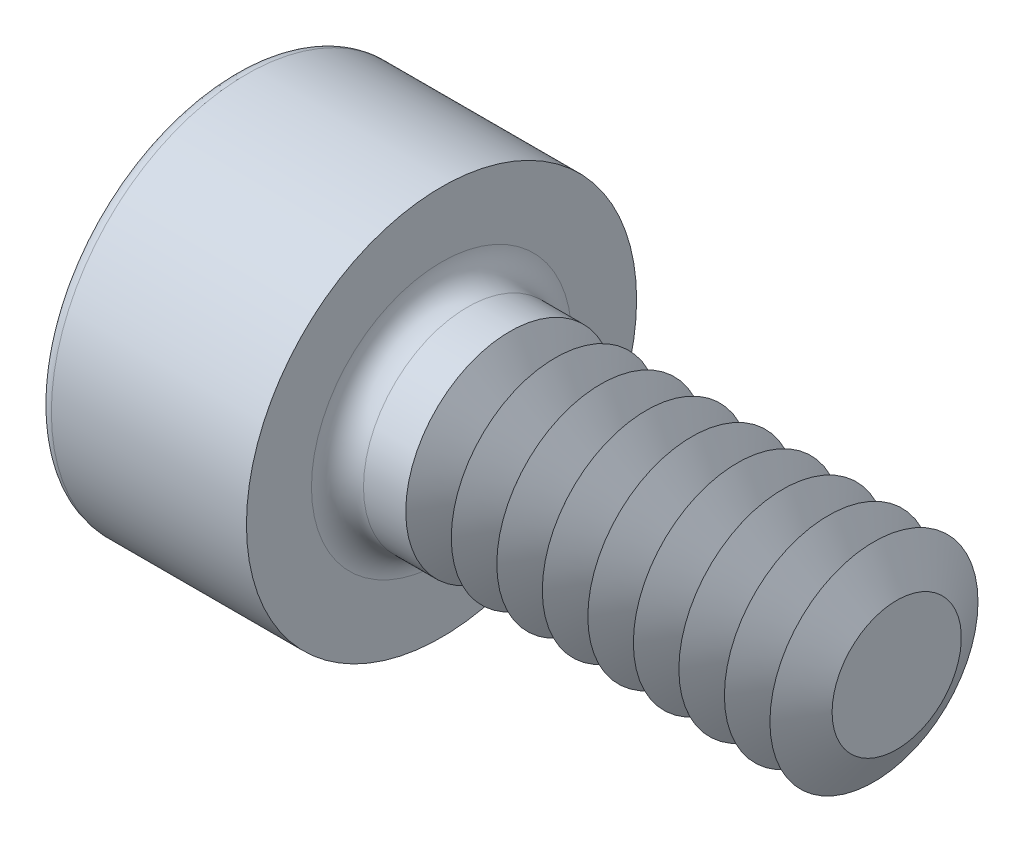
ISO-10303-21;
HEADER;
FILE_DESCRIPTION(('STEP AP214'),'2;1');
FILE_NAME('part.step','',(''),(''),'','','');
FILE_SCHEMA(('AUTOMOTIVE_DESIGN { 1 0 10303 214 1 1 1 1 }'));
ENDSEC;
DATA;
#1=APPLICATION_CONTEXT('core data for automotive mechanical design processes');
#2=APPLICATION_PROTOCOL_DEFINITION('international standard','automotive_design',2000,#1);
#3=PRODUCT_CONTEXT('',#1,'mechanical');
#4=PRODUCT('Part','Part','',(#3));
#5=PRODUCT_RELATED_PRODUCT_CATEGORY('part','',(#4));
#6=PRODUCT_DEFINITION_FORMATION('','',#4);
#7=PRODUCT_DEFINITION_CONTEXT('part definition',#1,'design');
#8=PRODUCT_DEFINITION('design','',#6,#7);
#9=PRODUCT_DEFINITION_SHAPE('','',#8);
#10=(LENGTH_UNIT() NAMED_UNIT(*) SI_UNIT(.MILLI.,.METRE.));
#11=(NAMED_UNIT(*) PLANE_ANGLE_UNIT() SI_UNIT($,.RADIAN.));
#12=(NAMED_UNIT(*) SI_UNIT($,.STERADIAN.) SOLID_ANGLE_UNIT());
#13=UNCERTAINTY_MEASURE_WITH_UNIT(LENGTH_MEASURE(1.E-05),#10,'distance_accuracy_value','');
#14=(GEOMETRIC_REPRESENTATION_CONTEXT(3) GLOBAL_UNCERTAINTY_ASSIGNED_CONTEXT((#13)) GLOBAL_UNIT_ASSIGNED_CONTEXT((#10,
#11,#12)) REPRESENTATION_CONTEXT('',''));
#15=CARTESIAN_POINT('',(0.,0.,0.));
#16=DIRECTION('',(0.,0.,1.));
#17=DIRECTION('',(1.,0.,0.));
#18=AXIS2_PLACEMENT_3D('',#15,#16,#17);
#19=CARTESIAN_POINT('',(0.,0.,0.));
#20=DIRECTION('',(-1.,0.,0.));
#21=DIRECTION('',(0.,0.,1.));
#22=AXIS2_PLACEMENT_3D('',#19,#20,#21);
#23=CYLINDRICAL_SURFACE('',#22,0.8);
#24=CARTESIAN_POINT('',(2.47500513340862,0.,0.));
#25=DIRECTION('',(-1.,0.,0.));
#26=DIRECTION('',(0.,0.,1.));
#27=AXIS2_PLACEMENT_3D('',#24,#25,#26);
#28=CIRCLE('',#27,0.8);
#29=CARTESIAN_POINT('',(2.47500513340862,0.,0.8));
#30=VERTEX_POINT('',#29);
#31=EDGE_CURVE('E299',#30,#30,#28,.T.);
#32=ORIENTED_EDGE('',*,*,#31,.T.);
#33=EDGE_LOOP('',(#32));
#34=FACE_BOUND('',#33,.T.);
#35=CARTESIAN_POINT('',(2.47499486659138,0.,0.));
#36=DIRECTION('',(-1.,0.,0.));
#37=DIRECTION('',(0.,0.,1.));
#38=AXIS2_PLACEMENT_3D('',#35,#36,#37);
#39=CIRCLE('',#38,0.8);
#40=CARTESIAN_POINT('',(2.47499486659138,0.,0.8));
#41=VERTEX_POINT('',#40);
#42=EDGE_CURVE('E295',#41,#41,#39,.T.);
#43=ORIENTED_EDGE('',*,*,#42,.F.);
#44=EDGE_LOOP('',(#43));
#45=FACE_BOUND('',#44,.T.);
#46=ADVANCED_FACE('F41',(#34,#45),#23,.T.);
#47=CARTESIAN_POINT('',(2.82500513340862,0.,0.));
#48=DIRECTION('',(-1.,0.,0.));
#49=DIRECTION('',(0.,0.,1.));
#50=AXIS2_PLACEMENT_3D('',#47,#48,#49);
#51=CIRCLE('',#50,0.8);
#52=CARTESIAN_POINT('',(2.82500513340862,0.,0.8));
#53=VERTEX_POINT('',#52);
#54=EDGE_CURVE('E312',#53,#53,#51,.T.);
#55=ORIENTED_EDGE('',*,*,#54,.T.);
#56=EDGE_LOOP('',(#55));
#57=FACE_BOUND('',#56,.T.);
#58=CARTESIAN_POINT('',(2.82499486659138,0.,0.));
#59=DIRECTION('',(-1.,0.,0.));
#60=DIRECTION('',(0.,0.,1.));
#61=AXIS2_PLACEMENT_3D('',#58,#59,#60);
#62=CIRCLE('',#61,0.8);
#63=CARTESIAN_POINT('',(2.82499486659138,0.,0.8));
#64=VERTEX_POINT('',#63);
#65=EDGE_CURVE('E301',#64,#64,#62,.T.);
#66=ORIENTED_EDGE('',*,*,#65,.F.);
#67=EDGE_LOOP('',(#66));
#68=FACE_BOUND('',#67,.T.);
#69=ADVANCED_FACE('F150',(#57,#68),#23,.T.);
#70=CARTESIAN_POINT('',(3.17500513340862,0.,0.));
#71=DIRECTION('',(-1.,0.,0.));
#72=DIRECTION('',(0.,0.,1.));
#73=AXIS2_PLACEMENT_3D('',#70,#71,#72);
#74=CIRCLE('',#73,0.8);
#75=CARTESIAN_POINT('',(3.17500513340862,0.,0.8));
#76=VERTEX_POINT('',#75);
#77=EDGE_CURVE('E321',#76,#76,#74,.T.);
#78=ORIENTED_EDGE('',*,*,#77,.T.);
#79=EDGE_LOOP('',(#78));
#80=FACE_BOUND('',#79,.T.);
#81=CARTESIAN_POINT('',(3.17499486659138,0.,0.));
#82=DIRECTION('',(-1.,0.,0.));
#83=DIRECTION('',(0.,0.,1.));
#84=AXIS2_PLACEMENT_3D('',#81,#82,#83);
#85=CIRCLE('',#84,0.8);
#86=CARTESIAN_POINT('',(3.17499486659138,0.,0.8));
#87=VERTEX_POINT('',#86);
#88=EDGE_CURVE('E315',#87,#87,#85,.T.);
#89=ORIENTED_EDGE('',*,*,#88,.F.);
#90=EDGE_LOOP('',(#89));
#91=FACE_BOUND('',#90,.T.);
#92=ADVANCED_FACE('F155',(#80,#91),#23,.T.);
#93=CARTESIAN_POINT('',(3.52500513340862,0.,0.));
#94=DIRECTION('',(-1.,0.,0.));
#95=DIRECTION('',(0.,0.,1.));
#96=AXIS2_PLACEMENT_3D('',#93,#94,#95);
#97=CIRCLE('',#96,0.8);
#98=CARTESIAN_POINT('',(3.52500513340862,0.,0.8));
#99=VERTEX_POINT('',#98);
#100=EDGE_CURVE('E330',#99,#99,#97,.T.);
#101=ORIENTED_EDGE('',*,*,#100,.T.);
#102=EDGE_LOOP('',(#101));
#103=FACE_BOUND('',#102,.T.);
#104=CARTESIAN_POINT('',(3.52499486659138,0.,0.));
#105=DIRECTION('',(-1.,0.,0.));
#106=DIRECTION('',(0.,0.,1.));
#107=AXIS2_PLACEMENT_3D('',#104,#105,#106);
#108=CIRCLE('',#107,0.8);
#109=CARTESIAN_POINT('',(3.52499486659138,0.,0.8));
#110=VERTEX_POINT('',#109);
#111=EDGE_CURVE('E324',#110,#110,#108,.T.);
#112=ORIENTED_EDGE('',*,*,#111,.F.);
#113=EDGE_LOOP('',(#112));
#114=FACE_BOUND('',#113,.T.);
#115=ADVANCED_FACE('F644',(#103,#114),#23,.T.);
#116=CARTESIAN_POINT('',(3.87500513340862,0.,0.));
#117=DIRECTION('',(-1.,0.,0.));
#118=DIRECTION('',(0.,0.,1.));
#119=AXIS2_PLACEMENT_3D('',#116,#117,#118);
#120=CIRCLE('',#119,0.8);
#121=CARTESIAN_POINT('',(3.87500513340862,0.,0.8));
#122=VERTEX_POINT('',#121);
#123=EDGE_CURVE('E339',#122,#122,#120,.T.);
#124=ORIENTED_EDGE('',*,*,#123,.T.);
#125=EDGE_LOOP('',(#124));
#126=FACE_BOUND('',#125,.T.);
#127=CARTESIAN_POINT('',(3.87499486659138,0.,0.));
#128=DIRECTION('',(-1.,0.,0.));
#129=DIRECTION('',(0.,0.,1.));
#130=AXIS2_PLACEMENT_3D('',#127,#128,#129);
#131=CIRCLE('',#130,0.8);
#132=CARTESIAN_POINT('',(3.87499486659138,0.,0.8));
#133=VERTEX_POINT('',#132);
#134=EDGE_CURVE('E333',#133,#133,#131,.T.);
#135=ORIENTED_EDGE('',*,*,#134,.F.);
#136=EDGE_LOOP('',(#135));
#137=FACE_BOUND('',#136,.T.);
#138=ADVANCED_FACE('F635',(#126,#137),#23,.T.);
#139=CARTESIAN_POINT('',(4.22500513340862,0.,0.));
#140=DIRECTION('',(-1.,0.,0.));
#141=DIRECTION('',(0.,0.,1.));
#142=AXIS2_PLACEMENT_3D('',#139,#140,#141);
#143=CIRCLE('',#142,0.8);
#144=CARTESIAN_POINT('',(4.22500513340862,0.,0.8));
#145=VERTEX_POINT('',#144);
#146=EDGE_CURVE('E348',#145,#145,#143,.T.);
#147=ORIENTED_EDGE('',*,*,#146,.T.);
#148=EDGE_LOOP('',(#147));
#149=FACE_BOUND('',#148,.T.);
#150=CARTESIAN_POINT('',(4.22499486659138,0.,0.));
#151=DIRECTION('',(-1.,0.,0.));
#152=DIRECTION('',(0.,0.,1.));
#153=AXIS2_PLACEMENT_3D('',#150,#151,#152);
#154=CIRCLE('',#153,0.8);
#155=CARTESIAN_POINT('',(4.22499486659138,0.,0.8));
#156=VERTEX_POINT('',#155);
#157=EDGE_CURVE('E342',#156,#156,#154,.T.);
#158=ORIENTED_EDGE('',*,*,#157,.F.);
#159=EDGE_LOOP('',(#158));
#160=FACE_BOUND('',#159,.T.);
#161=ADVANCED_FACE('F239',(#149,#160),#23,.T.);
#162=CARTESIAN_POINT('',(4.22500513340862,0.,0.));
#163=DIRECTION('',(-1.,0.,0.));
#164=DIRECTION('',(0.,0.,1.));
#165=AXIS2_PLACEMENT_3D('',#162,#163,#164);
#166=CONICAL_SURFACE('',#165,0.8,1.04719755119659);
#167=CARTESIAN_POINT('',(4.4,0.,0.));
#168=DIRECTION('',(-1.,0.,0.));
#169=DIRECTION('',(0.,0.,1.));
#170=AXIS2_PLACEMENT_3D('',#167,#168,#169);
#171=CIRCLE('',#170,0.4969);
#172=CARTESIAN_POINT('',(4.4,0.,0.4969));
#173=VERTEX_POINT('',#172);
#174=EDGE_CURVE('E354',#173,#173,#171,.T.);
#175=ORIENTED_EDGE('',*,*,#174,.T.);
#176=EDGE_LOOP('',(#175));
#177=FACE_BOUND('',#176,.T.);
#178=ORIENTED_EDGE('',*,*,#146,.F.);
#179=EDGE_LOOP('',(#178));
#180=FACE_BOUND('',#179,.T.);
#181=ADVANCED_FACE('F235',(#177,#180),#166,.T.);
#182=CARTESIAN_POINT('',(4.4,0.,0.));
#183=DIRECTION('',(1.,0.,0.));
#184=DIRECTION('',(0.,0.,-1.));
#185=AXIS2_PLACEMENT_3D('',#182,#183,#184);
#186=CONICAL_SURFACE('',#185,0.4969,1.04719755119659);
#187=CARTESIAN_POINT('',(4.57499486659138,0.,0.));
#188=DIRECTION('',(-1.,0.,0.));
#189=DIRECTION('',(0.,0.,1.));
#190=AXIS2_PLACEMENT_3D('',#187,#188,#189);
#191=CIRCLE('',#190,0.8);
#192=CARTESIAN_POINT('',(4.57499486659138,0.,0.8));
#193=VERTEX_POINT('',#192);
#194=EDGE_CURVE('E351',#193,#193,#191,.T.);
#195=ORIENTED_EDGE('',*,*,#194,.T.);
#196=EDGE_LOOP('',(#195));
#197=FACE_BOUND('',#196,.T.);
#198=ORIENTED_EDGE('',*,*,#174,.F.);
#199=EDGE_LOOP('',(#198));
#200=FACE_BOUND('',#199,.T.);
#201=ADVANCED_FACE('F238',(#197,#200),#186,.T.);
#202=CARTESIAN_POINT('',(5.1,0.8,0.));
#203=DIRECTION('',(-1.,0.,0.));
#204=DIRECTION('',(0.,0.,1.));
#205=AXIS2_PLACEMENT_3D('',#202,#203,#204);
#206=PLANE('',#205);
#207=CARTESIAN_POINT('',(5.1,0.,0.));
#208=DIRECTION('',(-1.,0.,0.));
#209=DIRECTION('',(0.,0.,1.));
#210=AXIS2_PLACEMENT_3D('',#207,#208,#209);
#211=CIRCLE('',#210,0.4969);
#212=CARTESIAN_POINT('',(5.1,0.,0.4969));
#213=VERTEX_POINT('',#212);
#214=EDGE_CURVE('E369',#213,#213,#211,.T.);
#215=ORIENTED_EDGE('',*,*,#214,.F.);
#216=EDGE_LOOP('',(#215));
#217=FACE_BOUND('',#216,.T.);
#218=ADVANCED_FACE('F161',(#217),#206,.F.);
#219=CARTESIAN_POINT('',(4.92500513340862,0.,0.));
#220=DIRECTION('',(-1.,0.,0.));
#221=DIRECTION('',(0.,0.,1.));
#222=AXIS2_PLACEMENT_3D('',#219,#220,#221);
#223=CONICAL_SURFACE('',#222,0.8,1.04719755119659);
#224=ORIENTED_EDGE('',*,*,#214,.T.);
#225=EDGE_LOOP('',(#224));
#226=FACE_BOUND('',#225,.T.);
#227=CARTESIAN_POINT('',(4.92500513340862,0.,0.));
#228=DIRECTION('',(-1.,0.,0.));
#229=DIRECTION('',(0.,0.,1.));
#230=AXIS2_PLACEMENT_3D('',#227,#228,#229);
#231=CIRCLE('',#230,0.8);
#232=CARTESIAN_POINT('',(4.92500513340862,0.,0.8));
#233=VERTEX_POINT('',#232);
#234=EDGE_CURVE('E366',#233,#233,#231,.T.);
#235=ORIENTED_EDGE('',*,*,#234,.F.);
#236=EDGE_LOOP('',(#235));
#237=FACE_BOUND('',#236,.T.);
#238=ADVANCED_FACE('F222',(#226,#237),#223,.T.);
#239=ORIENTED_EDGE('',*,*,#234,.T.);
#240=EDGE_LOOP('',(#239));
#241=FACE_BOUND('',#240,.T.);
#242=CARTESIAN_POINT('',(4.92499486659138,0.,0.));
#243=DIRECTION('',(-1.,0.,0.));
#244=DIRECTION('',(0.,0.,1.));
#245=AXIS2_PLACEMENT_3D('',#242,#243,#244);
#246=CIRCLE('',#245,0.8);
#247=CARTESIAN_POINT('',(4.92499486659138,0.,0.8));
#248=VERTEX_POINT('',#247);
#249=EDGE_CURVE('E360',#248,#248,#246,.T.);
#250=ORIENTED_EDGE('',*,*,#249,.F.);
#251=EDGE_LOOP('',(#250));
#252=FACE_BOUND('',#251,.T.);
#253=ADVANCED_FACE('F147',(#241,#252),#23,.T.);
#254=CARTESIAN_POINT('',(4.75,0.,0.));
#255=DIRECTION('',(1.,0.,0.));
#256=DIRECTION('',(0.,0.,-1.));
#257=AXIS2_PLACEMENT_3D('',#254,#255,#256);
#258=CONICAL_SURFACE('',#257,0.4969,1.04719755119659);
#259=ORIENTED_EDGE('',*,*,#249,.T.);
#260=EDGE_LOOP('',(#259));
#261=FACE_BOUND('',#260,.T.);
#262=CARTESIAN_POINT('',(4.75,0.,0.));
#263=DIRECTION('',(-1.,0.,0.));
#264=DIRECTION('',(0.,0.,1.));
#265=AXIS2_PLACEMENT_3D('',#262,#263,#264);
#266=CIRCLE('',#265,0.4969);
#267=CARTESIAN_POINT('',(4.75,0.,0.4969));
#268=VERTEX_POINT('',#267);
#269=EDGE_CURVE('E363',#268,#268,#266,.T.);
#270=ORIENTED_EDGE('',*,*,#269,.F.);
#271=EDGE_LOOP('',(#270));
#272=FACE_BOUND('',#271,.T.);
#273=ADVANCED_FACE('F230',(#261,#272),#258,.T.);
#274=CARTESIAN_POINT('',(4.57500513340862,0.,0.));
#275=DIRECTION('',(-1.,0.,0.));
#276=DIRECTION('',(0.,0.,1.));
#277=AXIS2_PLACEMENT_3D('',#274,#275,#276);
#278=CONICAL_SURFACE('',#277,0.8,1.04719755119659);
#279=ORIENTED_EDGE('',*,*,#269,.T.);
#280=EDGE_LOOP('',(#279));
#281=FACE_BOUND('',#280,.T.);
#282=CARTESIAN_POINT('',(4.57500513340862,0.,0.));
#283=DIRECTION('',(-1.,0.,0.));
#284=DIRECTION('',(0.,0.,1.));
#285=AXIS2_PLACEMENT_3D('',#282,#283,#284);
#286=CIRCLE('',#285,0.8);
#287=CARTESIAN_POINT('',(4.57500513340862,0.,0.8));
#288=VERTEX_POINT('',#287);
#289=EDGE_CURVE('E357',#288,#288,#286,.T.);
#290=ORIENTED_EDGE('',*,*,#289,.F.);
#291=EDGE_LOOP('',(#290));
#292=FACE_BOUND('',#291,.T.);
#293=ADVANCED_FACE('F226',(#281,#292),#278,.T.);
#294=ORIENTED_EDGE('',*,*,#289,.T.);
#295=EDGE_LOOP('',(#294));
#296=FACE_BOUND('',#295,.T.);
#297=ORIENTED_EDGE('',*,*,#194,.F.);
#298=EDGE_LOOP('',(#297));
#299=FACE_BOUND('',#298,.T.);
#300=ADVANCED_FACE('F229',(#296,#299),#23,.T.);
#301=CARTESIAN_POINT('',(3.87500513340862,0.,0.));
#302=DIRECTION('',(-1.,0.,0.));
#303=DIRECTION('',(0.,0.,1.));
#304=AXIS2_PLACEMENT_3D('',#301,#302,#303);
#305=CONICAL_SURFACE('',#304,0.8,1.04719755119659);
#306=CARTESIAN_POINT('',(4.05,0.,0.));
#307=DIRECTION('',(-1.,0.,0.));
#308=DIRECTION('',(0.,0.,1.));
#309=AXIS2_PLACEMENT_3D('',#306,#307,#308);
#310=CIRCLE('',#309,0.4969);
#311=CARTESIAN_POINT('',(4.05,0.,0.4969));
#312=VERTEX_POINT('',#311);
#313=EDGE_CURVE('E345',#312,#312,#310,.T.);
#314=ORIENTED_EDGE('',*,*,#313,.T.);
#315=EDGE_LOOP('',(#314));
#316=FACE_BOUND('',#315,.T.);
#317=ORIENTED_EDGE('',*,*,#123,.F.);
#318=EDGE_LOOP('',(#317));
#319=FACE_BOUND('',#318,.T.);
#320=ADVANCED_FACE('F244',(#316,#319),#305,.T.);
#321=CARTESIAN_POINT('',(4.05,0.,0.));
#322=DIRECTION('',(1.,0.,0.));
#323=DIRECTION('',(0.,0.,-1.));
#324=AXIS2_PLACEMENT_3D('',#321,#322,#323);
#325=CONICAL_SURFACE('',#324,0.4969,1.04719755119659);
#326=ORIENTED_EDGE('',*,*,#157,.T.);
#327=EDGE_LOOP('',(#326));
#328=FACE_BOUND('',#327,.T.);
#329=ORIENTED_EDGE('',*,*,#313,.F.);
#330=EDGE_LOOP('',(#329));
#331=FACE_BOUND('',#330,.T.);
#332=ADVANCED_FACE('F247',(#328,#331),#325,.T.);
#333=CARTESIAN_POINT('',(3.52500513340862,0.,0.));
#334=DIRECTION('',(-1.,0.,0.));
#335=DIRECTION('',(0.,0.,1.));
#336=AXIS2_PLACEMENT_3D('',#333,#334,#335);
#337=CONICAL_SURFACE('',#336,0.8,1.04719755119659);
#338=CARTESIAN_POINT('',(3.7,0.,0.));
#339=DIRECTION('',(-1.,0.,0.));
#340=DIRECTION('',(0.,0.,1.));
#341=AXIS2_PLACEMENT_3D('',#338,#339,#340);
#342=CIRCLE('',#341,0.4969);
#343=CARTESIAN_POINT('',(3.7,0.,0.4969));
#344=VERTEX_POINT('',#343);
#345=EDGE_CURVE('E336',#344,#344,#342,.T.);
#346=ORIENTED_EDGE('',*,*,#345,.T.);
#347=EDGE_LOOP('',(#346));
#348=FACE_BOUND('',#347,.T.);
#349=ORIENTED_EDGE('',*,*,#100,.F.);
#350=EDGE_LOOP('',(#349));
#351=FACE_BOUND('',#350,.T.);
#352=ADVANCED_FACE('F251',(#348,#351),#337,.T.);
#353=CARTESIAN_POINT('',(3.7,0.,0.));
#354=DIRECTION('',(1.,0.,0.));
#355=DIRECTION('',(0.,0.,-1.));
#356=AXIS2_PLACEMENT_3D('',#353,#354,#355);
#357=CONICAL_SURFACE('',#356,0.4969,1.04719755119659);
#358=ORIENTED_EDGE('',*,*,#134,.T.);
#359=EDGE_LOOP('',(#358));
#360=FACE_BOUND('',#359,.T.);
#361=ORIENTED_EDGE('',*,*,#345,.F.);
#362=EDGE_LOOP('',(#361));
#363=FACE_BOUND('',#362,.T.);
#364=ADVANCED_FACE('F255',(#360,#363),#357,.T.);
#365=CARTESIAN_POINT('',(3.17500513340862,0.,0.));
#366=DIRECTION('',(-1.,0.,0.));
#367=DIRECTION('',(0.,0.,1.));
#368=AXIS2_PLACEMENT_3D('',#365,#366,#367);
#369=CONICAL_SURFACE('',#368,0.8,1.04719755119659);
#370=CARTESIAN_POINT('',(3.35,0.,0.));
#371=DIRECTION('',(-1.,0.,0.));
#372=DIRECTION('',(0.,0.,1.));
#373=AXIS2_PLACEMENT_3D('',#370,#371,#372);
#374=CIRCLE('',#373,0.4969);
#375=CARTESIAN_POINT('',(3.35,0.,0.4969));
#376=VERTEX_POINT('',#375);
#377=EDGE_CURVE('E327',#376,#376,#374,.T.);
#378=ORIENTED_EDGE('',*,*,#377,.T.);
#379=EDGE_LOOP('',(#378));
#380=FACE_BOUND('',#379,.T.);
#381=ORIENTED_EDGE('',*,*,#77,.F.);
#382=EDGE_LOOP('',(#381));
#383=FACE_BOUND('',#382,.T.);
#384=ADVANCED_FACE('F259',(#380,#383),#369,.T.);
#385=CARTESIAN_POINT('',(3.35,0.,0.));
#386=DIRECTION('',(1.,0.,0.));
#387=DIRECTION('',(0.,0.,-1.));
#388=AXIS2_PLACEMENT_3D('',#385,#386,#387);
#389=CONICAL_SURFACE('',#388,0.4969,1.04719755119659);
#390=ORIENTED_EDGE('',*,*,#111,.T.);
#391=EDGE_LOOP('',(#390));
#392=FACE_BOUND('',#391,.T.);
#393=ORIENTED_EDGE('',*,*,#377,.F.);
#394=EDGE_LOOP('',(#393));
#395=FACE_BOUND('',#394,.T.);
#396=ADVANCED_FACE('F263',(#392,#395),#389,.T.);
#397=CARTESIAN_POINT('',(2.82500513340862,0.,0.));
#398=DIRECTION('',(-1.,0.,0.));
#399=DIRECTION('',(0.,0.,1.));
#400=AXIS2_PLACEMENT_3D('',#397,#398,#399);
#401=CONICAL_SURFACE('',#400,0.8,1.04719755119659);
#402=CARTESIAN_POINT('',(3.,0.,0.));
#403=DIRECTION('',(-1.,0.,0.));
#404=DIRECTION('',(0.,0.,1.));
#405=AXIS2_PLACEMENT_3D('',#402,#403,#404);
#406=CIRCLE('',#405,0.4969);
#407=CARTESIAN_POINT('',(3.,0.,0.4969));
#408=VERTEX_POINT('',#407);
#409=EDGE_CURVE('E318',#408,#408,#406,.T.);
#410=ORIENTED_EDGE('',*,*,#409,.T.);
#411=EDGE_LOOP('',(#410));
#412=FACE_BOUND('',#411,.T.);
#413=ORIENTED_EDGE('',*,*,#54,.F.);
#414=EDGE_LOOP('',(#413));
#415=FACE_BOUND('',#414,.T.);
#416=ADVANCED_FACE('F267',(#412,#415),#401,.T.);
#417=CARTESIAN_POINT('',(3.,0.,0.));
#418=DIRECTION('',(1.,0.,0.));
#419=DIRECTION('',(0.,0.,-1.));
#420=AXIS2_PLACEMENT_3D('',#417,#418,#419);
#421=CONICAL_SURFACE('',#420,0.4969,1.04719755119659);
#422=ORIENTED_EDGE('',*,*,#88,.T.);
#423=EDGE_LOOP('',(#422));
#424=FACE_BOUND('',#423,.T.);
#425=ORIENTED_EDGE('',*,*,#409,.F.);
#426=EDGE_LOOP('',(#425));
#427=FACE_BOUND('',#426,.T.);
#428=ADVANCED_FACE('F271',(#424,#427),#421,.T.);
#429=CARTESIAN_POINT('',(2.47500513340862,0.,0.));
#430=DIRECTION('',(-1.,0.,0.));
#431=DIRECTION('',(0.,0.,1.));
#432=AXIS2_PLACEMENT_3D('',#429,#430,#431);
#433=CONICAL_SURFACE('',#432,0.8,1.04719755119659);
#434=CARTESIAN_POINT('',(2.65,0.,0.));
#435=DIRECTION('',(-1.,0.,0.));
#436=DIRECTION('',(0.,0.,1.));
#437=AXIS2_PLACEMENT_3D('',#434,#435,#436);
#438=CIRCLE('',#437,0.4969);
#439=CARTESIAN_POINT('',(2.65,0.,0.4969));
#440=VERTEX_POINT('',#439);
#441=EDGE_CURVE('E309',#440,#440,#438,.T.);
#442=ORIENTED_EDGE('',*,*,#441,.T.);
#443=EDGE_LOOP('',(#442));
#444=FACE_BOUND('',#443,.T.);
#445=ORIENTED_EDGE('',*,*,#31,.F.);
#446=EDGE_LOOP('',(#445));
#447=FACE_BOUND('',#446,.T.);
#448=ADVANCED_FACE('F275',(#444,#447),#433,.T.);
#449=CARTESIAN_POINT('',(2.65,0.,0.));
#450=DIRECTION('',(1.,0.,0.));
#451=DIRECTION('',(0.,0.,-1.));
#452=AXIS2_PLACEMENT_3D('',#449,#450,#451);
#453=CONICAL_SURFACE('',#452,0.4969,1.04719755119659);
#454=ORIENTED_EDGE('',*,*,#65,.T.);
#455=EDGE_LOOP('',(#454));
#456=FACE_BOUND('',#455,.T.);
#457=ORIENTED_EDGE('',*,*,#441,.F.);
#458=EDGE_LOOP('',(#457));
#459=FACE_BOUND('',#458,.T.);
#460=ADVANCED_FACE('F279',(#456,#459),#453,.T.);
#461=CARTESIAN_POINT('',(2.12500513340862,0.,0.));
#462=DIRECTION('',(-1.,0.,0.));
#463=DIRECTION('',(0.,0.,1.));
#464=AXIS2_PLACEMENT_3D('',#461,#462,#463);
#465=CONICAL_SURFACE('',#464,0.8,1.04719755119659);
#466=CARTESIAN_POINT('',(2.3,0.,0.));
#467=DIRECTION('',(-1.,0.,0.));
#468=DIRECTION('',(0.,0.,1.));
#469=AXIS2_PLACEMENT_3D('',#466,#467,#468);
#470=CIRCLE('',#469,0.4969);
#471=CARTESIAN_POINT('',(2.3,0.,0.4969));
#472=VERTEX_POINT('',#471);
#473=EDGE_CURVE('E298',#472,#472,#470,.T.);
#474=ORIENTED_EDGE('',*,*,#473,.T.);
#475=EDGE_LOOP('',(#474));
#476=FACE_BOUND('',#475,.T.);
#477=CARTESIAN_POINT('',(2.12500513340862,0.,0.));
#478=DIRECTION('',(-1.,0.,0.));
#479=DIRECTION('',(0.,0.,1.));
#480=AXIS2_PLACEMENT_3D('',#477,#478,#479);
#481=CIRCLE('',#480,0.8);
#482=CARTESIAN_POINT('',(2.12500513340862,0.,0.8));
#483=VERTEX_POINT('',#482);
#484=EDGE_CURVE('E303',#483,#483,#481,.T.);
#485=ORIENTED_EDGE('',*,*,#484,.F.);
#486=EDGE_LOOP('',(#485));
#487=FACE_BOUND('',#486,.T.);
#488=ADVANCED_FACE('F283',(#476,#487),#465,.T.);
#489=CARTESIAN_POINT('',(2.3,0.,0.));
#490=DIRECTION('',(1.,0.,0.));
#491=DIRECTION('',(0.,0.,-1.));
#492=AXIS2_PLACEMENT_3D('',#489,#490,#491);
#493=CONICAL_SURFACE('',#492,0.4969,1.04719755119659);
#494=ORIENTED_EDGE('',*,*,#42,.T.);
#495=EDGE_LOOP('',(#494));
#496=FACE_BOUND('',#495,.T.);
#497=ORIENTED_EDGE('',*,*,#473,.F.);
#498=EDGE_LOOP('',(#497));
#499=FACE_BOUND('',#498,.T.);
#500=ADVANCED_FACE('F211',(#496,#499),#493,.T.);
#501=CARTESIAN_POINT('',(0.7,0.749111974273539,-0.4325));
#502=DIRECTION('',(-0.898067507594914,-0.439857649475667,0.));
#503=DIRECTION('',(0.439857649475667,-0.898067507594914,0.));
#504=AXIS2_PLACEMENT_3D('',#501,#502,#503);
#505=PLANE('',#504);
#506=DIRECTION('',(-0.39048865355203,0.797269689995388,-0.460303870135567));
#507=VECTOR('',#506,1.);
#508=CARTESIAN_POINT('',(1.06690185249043,0.,0.));
#509=LINE('',#508,#507);
#510=CARTESIAN_POINT('',(1.06690185249043,0.,0.));
#511=VERTEX_POINT('',#510);
#512=CARTESIAN_POINT('',(0.7,0.749111974273539,-0.4325));
#513=VERTEX_POINT('',#512);
#514=EDGE_CURVE('E378',#511,#513,#509,.T.);
#515=ORIENTED_EDGE('',*,*,#514,.F.);
#516=DIRECTION('',(-0.39048865355203,0.797269689995388,0.460303870135567));
#517=VECTOR('',#516,1.);
#518=CARTESIAN_POINT('',(1.06690185249043,0.,0.));
#519=LINE('',#518,#517);
#520=CARTESIAN_POINT('',(0.7,0.749111974273539,0.4325));
#521=VERTEX_POINT('',#520);
#522=EDGE_CURVE('E384',#511,#521,#519,.T.);
#523=ORIENTED_EDGE('',*,*,#522,.T.);
#524=DIRECTION('',(0.,0.,-1.));
#525=VECTOR('',#524,1.);
#526=CARTESIAN_POINT('',(0.7,0.749111974273539,0.4325));
#527=LINE('',#526,#525);
#528=EDGE_CURVE('E391',#521,#513,#527,.T.);
#529=ORIENTED_EDGE('',*,*,#528,.T.);
#530=EDGE_LOOP('',(#515,#523,#529));
#531=FACE_BOUND('',#530,.T.);
#532=ADVANCED_FACE('F207',(#531),#505,.T.);
#533=CARTESIAN_POINT('',(0.7,0.,-0.865));
#534=DIRECTION('',(-0.898067507594914,-0.219928824737834,0.380927898494839));
#535=DIRECTION('',(0.39048865355203,0.,0.920607740271133));
#536=AXIS2_PLACEMENT_3D('',#533,#534,#535);
#537=PLANE('',#536);
#538=DIRECTION('',(-0.39048865355203,0.,-0.920607740271133));
#539=VECTOR('',#538,1.);
#540=CARTESIAN_POINT('',(1.06690185249043,0.,0.));
#541=LINE('',#540,#539);
#542=CARTESIAN_POINT('',(0.7,0.,-0.865));
#543=VERTEX_POINT('',#542);
#544=EDGE_CURVE('E374',#511,#543,#541,.T.);
#545=ORIENTED_EDGE('',*,*,#544,.F.);
#546=ORIENTED_EDGE('',*,*,#514,.T.);
#547=DIRECTION('',(0.,-0.866025403784439,-0.5));
#548=VECTOR('',#547,1.);
#549=CARTESIAN_POINT('',(0.7,0.749111974273539,-0.4325));
#550=LINE('',#549,#548);
#551=EDGE_CURVE('E394',#513,#543,#550,.T.);
#552=ORIENTED_EDGE('',*,*,#551,.T.);
#553=EDGE_LOOP('',(#545,#546,#552));
#554=FACE_BOUND('',#553,.T.);
#555=ADVANCED_FACE('F210',(#554),#537,.T.);
#556=CARTESIAN_POINT('',(0.7,-0.749111974273539,-0.4325));
#557=DIRECTION('',(-0.898067507594914,0.219928824737834,0.380927898494839));
#558=DIRECTION('',(0.39048865355203,0.,0.920607740271133));
#559=AXIS2_PLACEMENT_3D('',#556,#557,#558);
#560=PLANE('',#559);
#561=DIRECTION('',(-0.39048865355203,-0.797269689995388,-0.460303870135567));
#562=VECTOR('',#561,1.);
#563=CARTESIAN_POINT('',(1.06690185249043,0.,0.));
#564=LINE('',#563,#562);
#565=CARTESIAN_POINT('',(0.7,-0.749111974273539,-0.4325));
#566=VERTEX_POINT('',#565);
#567=EDGE_CURVE('E65',#511,#566,#564,.T.);
#568=ORIENTED_EDGE('',*,*,#567,.F.);
#569=ORIENTED_EDGE('',*,*,#544,.T.);
#570=DIRECTION('',(0.,-0.866025403784439,0.5));
#571=VECTOR('',#570,1.);
#572=CARTESIAN_POINT('',(0.7,0.,-0.865));
#573=LINE('',#572,#571);
#574=EDGE_CURVE('E397',#543,#566,#573,.T.);
#575=ORIENTED_EDGE('',*,*,#574,.T.);
#576=EDGE_LOOP('',(#568,#569,#575));
#577=FACE_BOUND('',#576,.T.);
#578=ADVANCED_FACE('F215',(#577),#560,.T.);
#579=CARTESIAN_POINT('',(0.7,-0.749111974273539,0.4325));
#580=DIRECTION('',(-0.898067507594914,0.439857649475667,0.));
#581=DIRECTION('',(-0.439857649475667,-0.898067507594914,0.));
#582=AXIS2_PLACEMENT_3D('',#579,#580,#581);
#583=PLANE('',#582);
#584=DIRECTION('',(-0.39048865355203,-0.797269689995388,0.460303870135567));
#585=VECTOR('',#584,1.);
#586=CARTESIAN_POINT('',(1.06690185249043,0.,0.));
#587=LINE('',#586,#585);
#588=CARTESIAN_POINT('',(0.7,-0.749111974273539,0.4325));
#589=VERTEX_POINT('',#588);
#590=EDGE_CURVE('E381',#511,#589,#587,.T.);
#591=ORIENTED_EDGE('',*,*,#590,.F.);
#592=ORIENTED_EDGE('',*,*,#567,.T.);
#593=DIRECTION('',(0.,0.,1.));
#594=VECTOR('',#593,1.);
#595=CARTESIAN_POINT('',(0.7,-0.749111974273539,-0.4325));
#596=LINE('',#595,#594);
#597=EDGE_CURVE('E93',#566,#589,#596,.T.);
#598=ORIENTED_EDGE('',*,*,#597,.T.);
#599=EDGE_LOOP('',(#591,#592,#598));
#600=FACE_BOUND('',#599,.T.);
#601=ADVANCED_FACE('F205',(#600),#583,.T.);
#602=CARTESIAN_POINT('',(0.7,0.,0.865));
#603=DIRECTION('',(-0.898067507594914,0.219928824737834,-0.380927898494839));
#604=DIRECTION('',(-0.39048865355203,0.,0.920607740271134));
#605=AXIS2_PLACEMENT_3D('',#602,#603,#604);
#606=PLANE('',#605);
#607=DIRECTION('',(-0.39048865355203,0.,0.920607740271133));
#608=VECTOR('',#607,1.);
#609=CARTESIAN_POINT('',(1.06690185249043,0.,0.));
#610=LINE('',#609,#608);
#611=CARTESIAN_POINT('',(0.7,0.,0.865));
#612=VERTEX_POINT('',#611);
#613=EDGE_CURVE('E373',#511,#612,#610,.T.);
#614=ORIENTED_EDGE('',*,*,#613,.F.);
#615=ORIENTED_EDGE('',*,*,#590,.T.);
#616=DIRECTION('',(0.,0.866025403784439,0.5));
#617=VECTOR('',#616,1.);
#618=CARTESIAN_POINT('',(0.7,-0.749111974273539,0.4325));
#619=LINE('',#618,#617);
#620=EDGE_CURVE('E110',#589,#612,#619,.T.);
#621=ORIENTED_EDGE('',*,*,#620,.T.);
#622=EDGE_LOOP('',(#614,#615,#621));
#623=FACE_BOUND('',#622,.T.);
#624=ADVANCED_FACE('F201',(#623),#606,.T.);
#625=CARTESIAN_POINT('',(0.7,0.749111974273539,0.4325));
#626=DIRECTION('',(-0.898067507594914,-0.219928824737834,-0.380927898494839));
#627=DIRECTION('',(-0.39048865355203,0.,0.920607740271133));
#628=AXIS2_PLACEMENT_3D('',#625,#626,#627);
#629=PLANE('',#628);
#630=ORIENTED_EDGE('',*,*,#522,.F.);
#631=ORIENTED_EDGE('',*,*,#613,.T.);
#632=DIRECTION('',(0.,0.866025403784439,-0.5));
#633=VECTOR('',#632,1.);
#634=CARTESIAN_POINT('',(0.7,0.,0.865));
#635=LINE('',#634,#633);
#636=EDGE_CURVE('E113',#612,#521,#635,.T.);
#637=ORIENTED_EDGE('',*,*,#636,.T.);
#638=EDGE_LOOP('',(#630,#631,#637));
#639=FACE_BOUND('',#638,.T.);
#640=ADVANCED_FACE('F190',(#639),#629,.T.);
#641=CARTESIAN_POINT('',(0.7,0.749111974273539,0.4325));
#642=DIRECTION('',(0.,1.,0.));
#643=DIRECTION('',(0.,0.,1.));
#644=AXIS2_PLACEMENT_3D('',#641,#642,#643);
#645=PLANE('',#644);
#646=DIRECTION('',(0.,0.,-1.));
#647=VECTOR('',#646,1.);
#648=CARTESIAN_POINT('',(0.,0.749111974273539,0.4325));
#649=LINE('',#648,#647);
#650=CARTESIAN_POINT('',(0.,0.749111974273539,0.4325));
#651=VERTEX_POINT('',#650);
#652=CARTESIAN_POINT('',(0.,0.749111974273539,-0.4325));
#653=VERTEX_POINT('',#652);
#654=EDGE_CURVE('E403',#651,#653,#649,.T.);
#655=ORIENTED_EDGE('',*,*,#654,.T.);
#656=DIRECTION('',(-1.,0.,0.));
#657=VECTOR('',#656,1.);
#658=CARTESIAN_POINT('',(0.7,0.749111974273539,-0.4325));
#659=LINE('',#658,#657);
#660=EDGE_CURVE('E120',#513,#653,#659,.T.);
#661=ORIENTED_EDGE('',*,*,#660,.F.);
#662=ORIENTED_EDGE('',*,*,#528,.F.);
#663=DIRECTION('',(-1.,0.,0.));
#664=VECTOR('',#663,1.);
#665=CARTESIAN_POINT('',(0.7,0.749111974273539,0.4325));
#666=LINE('',#665,#664);
#667=EDGE_CURVE('E122',#521,#651,#666,.T.);
#668=ORIENTED_EDGE('',*,*,#667,.T.);
#669=EDGE_LOOP('',(#655,#661,#662,#668));
#670=FACE_BOUND('',#669,.T.);
#671=ADVANCED_FACE('F186',(#670),#645,.F.);
#672=CARTESIAN_POINT('',(0.7,0.749111974273539,-0.4325));
#673=DIRECTION('',(0.,0.5,-0.866025403784439));
#674=DIRECTION('',(0.,0.866025403784439,0.5));
#675=AXIS2_PLACEMENT_3D('',#672,#673,#674);
#676=PLANE('',#675);
#677=DIRECTION('',(0.,-0.866025403784439,-0.5));
#678=VECTOR('',#677,1.);
#679=CARTESIAN_POINT('',(0.,0.749111974273539,-0.4325));
#680=LINE('',#679,#678);
#681=CARTESIAN_POINT('',(0.,0.,-0.865));
#682=VERTEX_POINT('',#681);
#683=EDGE_CURVE('E106',#653,#682,#680,.T.);
#684=ORIENTED_EDGE('',*,*,#683,.T.);
#685=DIRECTION('',(-1.,0.,0.));
#686=VECTOR('',#685,1.);
#687=CARTESIAN_POINT('',(0.7,0.,-0.865));
#688=LINE('',#687,#686);
#689=EDGE_CURVE('E97',#543,#682,#688,.T.);
#690=ORIENTED_EDGE('',*,*,#689,.F.);
#691=ORIENTED_EDGE('',*,*,#551,.F.);
#692=ORIENTED_EDGE('',*,*,#660,.T.);
#693=EDGE_LOOP('',(#684,#690,#691,#692));
#694=FACE_BOUND('',#693,.T.);
#695=ADVANCED_FACE('F189',(#694),#676,.F.);
#696=CARTESIAN_POINT('',(0.7,0.,-0.865));
#697=DIRECTION('',(0.,-0.5,-0.866025403784439));
#698=DIRECTION('',(0.,0.866025403784439,-0.5));
#699=AXIS2_PLACEMENT_3D('',#696,#697,#698);
#700=PLANE('',#699);
#701=DIRECTION('',(0.,-0.866025403784439,0.5));
#702=VECTOR('',#701,1.);
#703=CARTESIAN_POINT('',(0.,0.,-0.865));
#704=LINE('',#703,#702);
#705=CARTESIAN_POINT('',(0.,-0.749111974273539,-0.4325));
#706=VERTEX_POINT('',#705);
#707=EDGE_CURVE('E100',#682,#706,#704,.T.);
#708=ORIENTED_EDGE('',*,*,#707,.T.);
#709=DIRECTION('',(-1.,0.,0.));
#710=VECTOR('',#709,1.);
#711=CARTESIAN_POINT('',(0.7,-0.749111974273539,-0.4325));
#712=LINE('',#711,#710);
#713=EDGE_CURVE('E87',#566,#706,#712,.T.);
#714=ORIENTED_EDGE('',*,*,#713,.F.);
#715=ORIENTED_EDGE('',*,*,#574,.F.);
#716=ORIENTED_EDGE('',*,*,#689,.T.);
#717=EDGE_LOOP('',(#708,#714,#715,#716));
#718=FACE_BOUND('',#717,.T.);
#719=ADVANCED_FACE('F101',(#718),#700,.F.);
#720=CARTESIAN_POINT('',(0.7,-0.749111974273539,-0.4325));
#721=DIRECTION('',(0.,-1.,0.));
#722=DIRECTION('',(0.,0.,-1.));
#723=AXIS2_PLACEMENT_3D('',#720,#721,#722);
#724=PLANE('',#723);
#725=DIRECTION('',(0.,0.,1.));
#726=VECTOR('',#725,1.);
#727=CARTESIAN_POINT('',(0.,-0.749111974273539,-0.4325));
#728=LINE('',#727,#726);
#729=CARTESIAN_POINT('',(0.,-0.749111974273539,0.4325));
#730=VERTEX_POINT('',#729);
#731=EDGE_CURVE('E92',#706,#730,#728,.T.);
#732=ORIENTED_EDGE('',*,*,#731,.T.);
#733=DIRECTION('',(-1.,0.,0.));
#734=VECTOR('',#733,1.);
#735=CARTESIAN_POINT('',(0.7,-0.749111974273539,0.4325));
#736=LINE('',#735,#734);
#737=EDGE_CURVE('E96',#589,#730,#736,.T.);
#738=ORIENTED_EDGE('',*,*,#737,.F.);
#739=ORIENTED_EDGE('',*,*,#597,.F.);
#740=ORIENTED_EDGE('',*,*,#713,.T.);
#741=EDGE_LOOP('',(#732,#738,#739,#740));
#742=FACE_BOUND('',#741,.T.);
#743=ADVANCED_FACE('F89',(#742),#724,.F.);
#744=CARTESIAN_POINT('',(0.7,-0.749111974273539,0.4325));
#745=DIRECTION('',(0.,-0.5,0.866025403784439));
#746=DIRECTION('',(0.,-0.866025403784439,-0.5));
#747=AXIS2_PLACEMENT_3D('',#744,#745,#746);
#748=PLANE('',#747);
#749=DIRECTION('',(0.,0.866025403784439,0.5));
#750=VECTOR('',#749,1.);
#751=CARTESIAN_POINT('',(0.,-0.749111974273539,0.4325));
#752=LINE('',#751,#750);
#753=CARTESIAN_POINT('',(0.,0.,0.865));
#754=VERTEX_POINT('',#753);
#755=EDGE_CURVE('E56',#730,#754,#752,.T.);
#756=ORIENTED_EDGE('',*,*,#755,.T.);
#757=DIRECTION('',(-1.,0.,0.));
#758=VECTOR('',#757,1.);
#759=CARTESIAN_POINT('',(0.7,0.,0.865));
#760=LINE('',#759,#758);
#761=EDGE_CURVE('E124',#612,#754,#760,.T.);
#762=ORIENTED_EDGE('',*,*,#761,.F.);
#763=ORIENTED_EDGE('',*,*,#620,.F.);
#764=ORIENTED_EDGE('',*,*,#737,.T.);
#765=EDGE_LOOP('',(#756,#762,#763,#764));
#766=FACE_BOUND('',#765,.T.);
#767=ADVANCED_FACE('F178',(#766),#748,.F.);
#768=CARTESIAN_POINT('',(0.7,0.,0.865));
#769=DIRECTION('',(0.,0.5,0.866025403784439));
#770=DIRECTION('',(0.,-0.866025403784439,0.5));
#771=AXIS2_PLACEMENT_3D('',#768,#769,#770);
#772=PLANE('',#771);
#773=DIRECTION('',(0.,0.866025403784439,-0.5));
#774=VECTOR('',#773,1.);
#775=CARTESIAN_POINT('',(0.,0.,0.865));
#776=LINE('',#775,#774);
#777=EDGE_CURVE('E401',#754,#651,#776,.T.);
#778=ORIENTED_EDGE('',*,*,#777,.T.);
#779=ORIENTED_EDGE('',*,*,#667,.F.);
#780=ORIENTED_EDGE('',*,*,#636,.F.);
#781=ORIENTED_EDGE('',*,*,#761,.T.);
#782=EDGE_LOOP('',(#778,#779,#780,#781));
#783=FACE_BOUND('',#782,.T.);
#784=ADVANCED_FACE('F174',(#783),#772,.F.);
#785=CARTESIAN_POINT('',(0.,0.,0.));
#786=DIRECTION('',(1.,0.,0.));
#787=DIRECTION('',(0.,0.,-1.));
#788=AXIS2_PLACEMENT_3D('',#785,#786,#787);
#789=PLANE('',#788);
#790=CARTESIAN_POINT('',(0.,0.,0.));
#791=DIRECTION('',(1.,0.,0.));
#792=DIRECTION('',(0.,0.,-1.));
#793=AXIS2_PLACEMENT_3D('',#790,#791,#792);
#794=CIRCLE('',#793,1.4);
#795=CARTESIAN_POINT('',(0.,0.,-1.4));
#796=VERTEX_POINT('',#795);
#797=EDGE_CURVE('E49',#796,#796,#794,.F.);
#798=ORIENTED_EDGE('',*,*,#797,.T.);
#799=EDGE_LOOP('',(#798));
#800=FACE_BOUND('',#799,.T.);
#801=ORIENTED_EDGE('',*,*,#777,.F.);
#802=ORIENTED_EDGE('',*,*,#755,.F.);
#803=ORIENTED_EDGE('',*,*,#731,.F.);
#804=ORIENTED_EDGE('',*,*,#707,.F.);
#805=ORIENTED_EDGE('',*,*,#683,.F.);
#806=ORIENTED_EDGE('',*,*,#654,.F.);
#807=EDGE_LOOP('',(#801,#802,#803,#804,#805,#806));
#808=FACE_BOUND('',#807,.T.);
#809=ADVANCED_FACE('F109',(#800,#808),#789,.F.);
#810=CARTESIAN_POINT('',(0.,0.,0.));
#811=DIRECTION('',(-1.,0.,0.));
#812=DIRECTION('',(0.,0.,1.));
#813=AXIS2_PLACEMENT_3D('',#810,#811,#812);
#814=CYLINDRICAL_SURFACE('',#813,1.5);
#815=CARTESIAN_POINT('',(0.1,0.,0.));
#816=DIRECTION('',(1.,0.,0.));
#817=DIRECTION('',(0.,0.,-1.));
#818=AXIS2_PLACEMENT_3D('',#815,#816,#817);
#819=CIRCLE('',#818,1.5);
#820=CARTESIAN_POINT('',(0.1,0.,-1.5));
#821=VERTEX_POINT('',#820);
#822=EDGE_CURVE('E11',#821,#821,#819,.T.);
#823=ORIENTED_EDGE('',*,*,#822,.T.);
#824=EDGE_LOOP('',(#823));
#825=FACE_BOUND('',#824,.T.);
#826=CARTESIAN_POINT('',(1.6,0.,0.));
#827=DIRECTION('',(-1.,0.,0.));
#828=DIRECTION('',(0.,0.,1.));
#829=AXIS2_PLACEMENT_3D('',#826,#827,#828);
#830=CIRCLE('',#829,1.5);
#831=CARTESIAN_POINT('',(1.6,0.,1.5));
#832=VERTEX_POINT('',#831);
#833=EDGE_CURVE('E131',#832,#832,#830,.T.);
#834=ORIENTED_EDGE('',*,*,#833,.T.);
#835=EDGE_LOOP('',(#834));
#836=FACE_BOUND('',#835,.T.);
#837=ADVANCED_FACE('F169',(#825,#836),#814,.T.);
#838=CARTESIAN_POINT('',(1.6,1.5,0.));
#839=DIRECTION('',(-1.,0.,0.));
#840=DIRECTION('',(0.,0.,1.));
#841=AXIS2_PLACEMENT_3D('',#838,#839,#840);
#842=PLANE('',#841);
#843=ORIENTED_EDGE('',*,*,#833,.F.);
#844=EDGE_LOOP('',(#843));
#845=FACE_BOUND('',#844,.T.);
#846=CARTESIAN_POINT('',(1.6,0.,0.));
#847=DIRECTION('',(-1.,0.,0.));
#848=DIRECTION('',(0.,0.,1.));
#849=AXIS2_PLACEMENT_3D('',#846,#847,#848);
#850=CIRCLE('',#849,1.);
#851=CARTESIAN_POINT('',(1.6,0.,1.));
#852=VERTEX_POINT('',#851);
#853=EDGE_CURVE('E128',#852,#852,#850,.T.);
#854=ORIENTED_EDGE('',*,*,#853,.T.);
#855=EDGE_LOOP('',(#854));
#856=FACE_BOUND('',#855,.T.);
#857=ADVANCED_FACE('F165',(#845,#856),#842,.F.);
#858=CARTESIAN_POINT('',(1.8,0.,0.));
#859=DIRECTION('',(-1.,0.,0.));
#860=DIRECTION('',(0.,0.,1.));
#861=AXIS2_PLACEMENT_3D('',#858,#859,#860);
#862=TOROIDAL_SURFACE('',#861,1.,0.2);
#863=ORIENTED_EDGE('',*,*,#853,.F.);
#864=EDGE_LOOP('',(#863));
#865=FACE_BOUND('',#864,.T.);
#866=CARTESIAN_POINT('',(1.8,0.,0.));
#867=DIRECTION('',(-1.,0.,0.));
#868=DIRECTION('',(0.,0.,1.));
#869=AXIS2_PLACEMENT_3D('',#866,#867,#868);
#870=CIRCLE('',#869,0.8);
#871=CARTESIAN_POINT('',(1.8,0.,0.8));
#872=VERTEX_POINT('',#871);
#873=EDGE_CURVE('E117',#872,#872,#870,.T.);
#874=ORIENTED_EDGE('',*,*,#873,.T.);
#875=EDGE_LOOP('',(#874));
#876=FACE_BOUND('',#875,.T.);
#877=ADVANCED_FACE('F144',(#865,#876),#862,.F.);
#878=ORIENTED_EDGE('',*,*,#873,.F.);
#879=EDGE_LOOP('',(#878));
#880=FACE_BOUND('',#879,.T.);
#881=ORIENTED_EDGE('',*,*,#484,.T.);
#882=EDGE_LOOP('',(#881));
#883=FACE_BOUND('',#882,.T.);
#884=ADVANCED_FACE('F139',(#880,#883),#23,.T.);
#885=CARTESIAN_POINT('',(0.1,0.,0.));
#886=DIRECTION('',(1.,0.,0.));
#887=DIRECTION('',(0.,0.,-1.));
#888=AXIS2_PLACEMENT_3D('',#885,#886,#887);
#889=TOROIDAL_SURFACE('',#888,1.4,0.1);
#890=ORIENTED_EDGE('',*,*,#822,.F.);
#891=EDGE_LOOP('',(#890));
#892=FACE_BOUND('',#891,.T.);
#893=ORIENTED_EDGE('',*,*,#797,.F.);
#894=EDGE_LOOP('',(#893));
#895=FACE_BOUND('',#894,.T.);
#896=ADVANCED_FACE('F43',(#892,#895),#889,.T.);
#897=CLOSED_SHELL('',(#46,#69,#92,#115,#138,#161,#181,#201,#218,#238,#253,#273,#293,#300,#320,
#332,#352,#364,#384,#396,#416,#428,#448,#460,#488,#500,#532,#555,#578,#601,#624,#640,#671,#695,
#719,#743,#767,#784,#809,#837,#857,#877,#884,#896));
#898=MANIFOLD_SOLID_BREP('B2',#897);
#899=ADVANCED_BREP_SHAPE_REPRESENTATION('',(#18,#898),#14);
#900=SHAPE_DEFINITION_REPRESENTATION(#9,#899);
ENDSEC;
END-ISO-10303-21;
